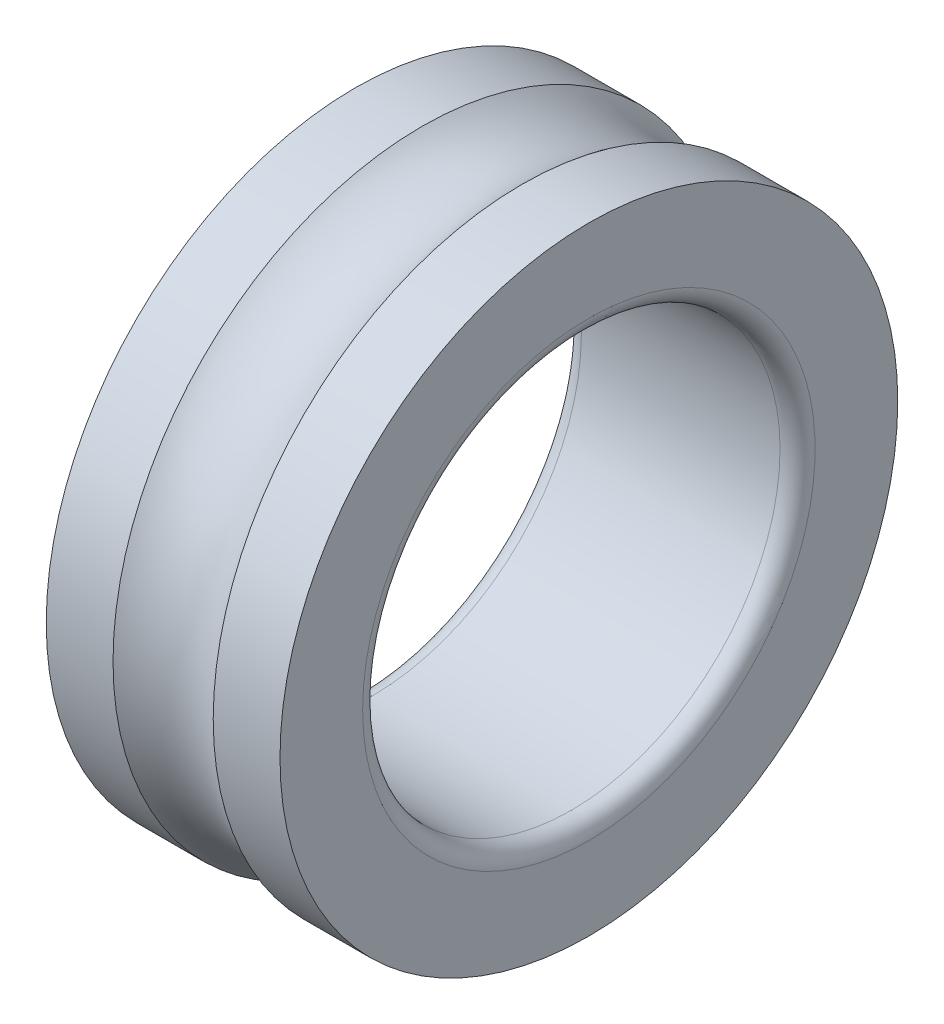
ISO-10303-21;
HEADER;
FILE_DESCRIPTION(('STEP AP214'),'2;1');
FILE_NAME('part.step','',(''),(''),'','','');
FILE_SCHEMA(('AUTOMOTIVE_DESIGN { 1 0 10303 214 1 1 1 1 }'));
ENDSEC;
DATA;
#1=APPLICATION_CONTEXT('core data for automotive mechanical design processes');
#2=APPLICATION_PROTOCOL_DEFINITION('international standard','automotive_design',2000,#1);
#3=PRODUCT_CONTEXT('',#1,'mechanical');
#4=PRODUCT('Part','Part','',(#3));
#5=PRODUCT_RELATED_PRODUCT_CATEGORY('part','',(#4));
#6=PRODUCT_DEFINITION_FORMATION('','',#4);
#7=PRODUCT_DEFINITION_CONTEXT('part definition',#1,'design');
#8=PRODUCT_DEFINITION('design','',#6,#7);
#9=PRODUCT_DEFINITION_SHAPE('','',#8);
#10=(LENGTH_UNIT() NAMED_UNIT(*) SI_UNIT(.MILLI.,.METRE.));
#11=(NAMED_UNIT(*) PLANE_ANGLE_UNIT() SI_UNIT($,.RADIAN.));
#12=(NAMED_UNIT(*) SI_UNIT($,.STERADIAN.) SOLID_ANGLE_UNIT());
#13=UNCERTAINTY_MEASURE_WITH_UNIT(LENGTH_MEASURE(1.E-05),#10,'distance_accuracy_value','');
#14=(GEOMETRIC_REPRESENTATION_CONTEXT(3) GLOBAL_UNCERTAINTY_ASSIGNED_CONTEXT((#13)) GLOBAL_UNIT_ASSIGNED_CONTEXT((#10,
#11,#12)) REPRESENTATION_CONTEXT('',''));
#15=CARTESIAN_POINT('',(0.,0.,0.));
#16=DIRECTION('',(0.,0.,1.));
#17=DIRECTION('',(1.,0.,0.));
#18=AXIS2_PLACEMENT_3D('',#15,#16,#17);
#19=CARTESIAN_POINT('',(-14.,37.,0.));
#20=DIRECTION('',(1.,0.,0.));
#21=DIRECTION('',(0.,0.,-1.));
#22=AXIS2_PLACEMENT_3D('',#19,#20,#21);
#23=PLANE('',#22);
#24=CARTESIAN_POINT('',(-14.,0.,0.));
#25=DIRECTION('',(-1.,0.,0.));
#26=DIRECTION('',(0.,0.,1.));
#27=AXIS2_PLACEMENT_3D('',#24,#25,#26);
#28=CIRCLE('',#27,27.1);
#29=CARTESIAN_POINT('',(-14.,0.,27.1));
#30=VERTEX_POINT('',#29);
#31=EDGE_CURVE('E10',#30,#30,#28,.T.);
#32=ORIENTED_EDGE('',*,*,#31,.F.);
#33=EDGE_LOOP('',(#32));
#34=FACE_BOUND('',#33,.T.);
#35=CARTESIAN_POINT('',(-14.,0.,0.));
#36=DIRECTION('',(-1.,0.,0.));
#37=DIRECTION('',(0.,0.,1.));
#38=AXIS2_PLACEMENT_3D('',#35,#36,#37);
#39=CIRCLE('',#38,37.);
#40=CARTESIAN_POINT('',(-14.,0.,37.));
#41=VERTEX_POINT('',#40);
#42=EDGE_CURVE('E60',#41,#41,#39,.T.);
#43=ORIENTED_EDGE('',*,*,#42,.T.);
#44=EDGE_LOOP('',(#43));
#45=FACE_BOUND('',#44,.T.);
#46=ADVANCED_FACE('F32',(#34,#45),#23,.F.);
#47=CARTESIAN_POINT('',(-11.9,0.,0.));
#48=DIRECTION('',(-1.,0.,0.));
#49=DIRECTION('',(0.,0.,1.));
#50=AXIS2_PLACEMENT_3D('',#47,#48,#49);
#51=TOROIDAL_SURFACE('',#50,27.1,2.1);
#52=CARTESIAN_POINT('',(-11.9,0.,0.));
#53=DIRECTION('',(-1.,0.,0.));
#54=DIRECTION('',(0.,0.,1.));
#55=AXIS2_PLACEMENT_3D('',#52,#53,#54);
#56=CIRCLE('',#55,25.);
#57=CARTESIAN_POINT('',(-11.9,0.,25.));
#58=VERTEX_POINT('',#57);
#59=EDGE_CURVE('E38',#58,#58,#56,.T.);
#60=ORIENTED_EDGE('',*,*,#59,.F.);
#61=EDGE_LOOP('',(#60));
#62=FACE_BOUND('',#61,.T.);
#63=ORIENTED_EDGE('',*,*,#31,.T.);
#64=EDGE_LOOP('',(#63));
#65=FACE_BOUND('',#64,.T.);
#66=ADVANCED_FACE('F97',(#62,#65),#51,.T.);
#67=CARTESIAN_POINT('',(-28.3637470566643,0.,0.));
#68=DIRECTION('',(-1.,0.,0.));
#69=DIRECTION('',(0.,0.,1.));
#70=AXIS2_PLACEMENT_3D('',#67,#68,#69);
#71=CYLINDRICAL_SURFACE('',#70,25.);
#72=CARTESIAN_POINT('',(11.9,0.,0.));
#73=DIRECTION('',(-1.,0.,0.));
#74=DIRECTION('',(0.,0.,1.));
#75=AXIS2_PLACEMENT_3D('',#72,#73,#74);
#76=CIRCLE('',#75,25.);
#77=CARTESIAN_POINT('',(11.9,0.,25.));
#78=VERTEX_POINT('',#77);
#79=EDGE_CURVE('E42',#78,#78,#76,.T.);
#80=ORIENTED_EDGE('',*,*,#79,.F.);
#81=EDGE_LOOP('',(#80));
#82=FACE_BOUND('',#81,.T.);
#83=ORIENTED_EDGE('',*,*,#59,.T.);
#84=EDGE_LOOP('',(#83));
#85=FACE_BOUND('',#84,.T.);
#86=ADVANCED_FACE('F92',(#82,#85),#71,.F.);
#87=CARTESIAN_POINT('',(11.9,0.,0.));
#88=DIRECTION('',(-1.,0.,0.));
#89=DIRECTION('',(0.,0.,1.));
#90=AXIS2_PLACEMENT_3D('',#87,#88,#89);
#91=TOROIDAL_SURFACE('',#90,27.1,2.1);
#92=CARTESIAN_POINT('',(14.,0.,0.));
#93=DIRECTION('',(-1.,0.,0.));
#94=DIRECTION('',(0.,0.,1.));
#95=AXIS2_PLACEMENT_3D('',#92,#93,#94);
#96=CIRCLE('',#95,27.1);
#97=CARTESIAN_POINT('',(14.,0.,27.1));
#98=VERTEX_POINT('',#97);
#99=EDGE_CURVE('E46',#98,#98,#96,.T.);
#100=ORIENTED_EDGE('',*,*,#99,.F.);
#101=EDGE_LOOP('',(#100));
#102=FACE_BOUND('',#101,.T.);
#103=ORIENTED_EDGE('',*,*,#79,.T.);
#104=EDGE_LOOP('',(#103));
#105=FACE_BOUND('',#104,.T.);
#106=ADVANCED_FACE('F86',(#102,#105),#91,.T.);
#107=CARTESIAN_POINT('',(14.,37.,0.));
#108=DIRECTION('',(-1.,0.,0.));
#109=DIRECTION('',(0.,0.,1.));
#110=AXIS2_PLACEMENT_3D('',#107,#108,#109);
#111=PLANE('',#110);
#112=CARTESIAN_POINT('',(14.,0.,0.));
#113=DIRECTION('',(-1.,0.,0.));
#114=DIRECTION('',(0.,0.,1.));
#115=AXIS2_PLACEMENT_3D('',#112,#113,#114);
#116=CIRCLE('',#115,37.);
#117=CARTESIAN_POINT('',(14.,0.,37.));
#118=VERTEX_POINT('',#117);
#119=EDGE_CURVE('E51',#118,#118,#116,.T.);
#120=ORIENTED_EDGE('',*,*,#119,.F.);
#121=EDGE_LOOP('',(#120));
#122=FACE_BOUND('',#121,.T.);
#123=ORIENTED_EDGE('',*,*,#99,.T.);
#124=EDGE_LOOP('',(#123));
#125=FACE_BOUND('',#124,.T.);
#126=ADVANCED_FACE('F80',(#122,#125),#111,.F.);
#127=CARTESIAN_POINT('',(-28.3637470566643,0.,0.));
#128=DIRECTION('',(-1.,0.,0.));
#129=DIRECTION('',(0.,0.,1.));
#130=AXIS2_PLACEMENT_3D('',#127,#128,#129);
#131=CYLINDRICAL_SURFACE('',#130,37.);
#132=CARTESIAN_POINT('',(6.00000000000001,0.,0.));
#133=DIRECTION('',(-1.,0.,0.));
#134=DIRECTION('',(0.,0.,1.));
#135=AXIS2_PLACEMENT_3D('',#132,#133,#134);
#136=CIRCLE('',#135,37.);
#137=CARTESIAN_POINT('',(6.00000000000001,0.,37.));
#138=VERTEX_POINT('',#137);
#139=EDGE_CURVE('E54',#138,#138,#136,.T.);
#140=ORIENTED_EDGE('',*,*,#139,.F.);
#141=EDGE_LOOP('',(#140));
#142=FACE_BOUND('',#141,.T.);
#143=ORIENTED_EDGE('',*,*,#119,.T.);
#144=EDGE_LOOP('',(#143));
#145=FACE_BOUND('',#144,.T.);
#146=ADVANCED_FACE('F74',(#142,#145),#131,.T.);
#147=CARTESIAN_POINT('',(0.,0.,0.));
#148=DIRECTION('',(-1.,0.,0.));
#149=DIRECTION('',(0.,0.,1.));
#150=AXIS2_PLACEMENT_3D('',#147,#148,#149);
#151=TOROIDAL_SURFACE('',#150,45.,10.);
#152=CARTESIAN_POINT('',(-5.99999999999999,0.,0.));
#153=DIRECTION('',(-1.,0.,0.));
#154=DIRECTION('',(0.,0.,1.));
#155=AXIS2_PLACEMENT_3D('',#152,#153,#154);
#156=CIRCLE('',#155,37.);
#157=CARTESIAN_POINT('',(-5.99999999999999,0.,37.));
#158=VERTEX_POINT('',#157);
#159=EDGE_CURVE('E57',#158,#158,#156,.T.);
#160=ORIENTED_EDGE('',*,*,#159,.F.);
#161=EDGE_LOOP('',(#160));
#162=FACE_BOUND('',#161,.T.);
#163=ORIENTED_EDGE('',*,*,#139,.T.);
#164=EDGE_LOOP('',(#163));
#165=FACE_BOUND('',#164,.T.);
#166=ADVANCED_FACE('F68',(#162,#165),#151,.F.);
#167=CARTESIAN_POINT('',(-28.3637470566643,0.,0.));
#168=DIRECTION('',(-1.,0.,0.));
#169=DIRECTION('',(0.,0.,1.));
#170=AXIS2_PLACEMENT_3D('',#167,#168,#169);
#171=CYLINDRICAL_SURFACE('',#170,37.);
#172=ORIENTED_EDGE('',*,*,#42,.F.);
#173=EDGE_LOOP('',(#172));
#174=FACE_BOUND('',#173,.T.);
#175=ORIENTED_EDGE('',*,*,#159,.T.);
#176=EDGE_LOOP('',(#175));
#177=FACE_BOUND('',#176,.T.);
#178=ADVANCED_FACE('F65',(#174,#177),#171,.T.);
#179=CLOSED_SHELL('',(#46,#66,#86,#106,#126,#146,#166,#178));
#180=MANIFOLD_SOLID_BREP('B2',#179);
#181=ADVANCED_BREP_SHAPE_REPRESENTATION('',(#18,#180),#14);
#182=SHAPE_DEFINITION_REPRESENTATION(#9,#181);
ENDSEC;
END-ISO-10303-21;
